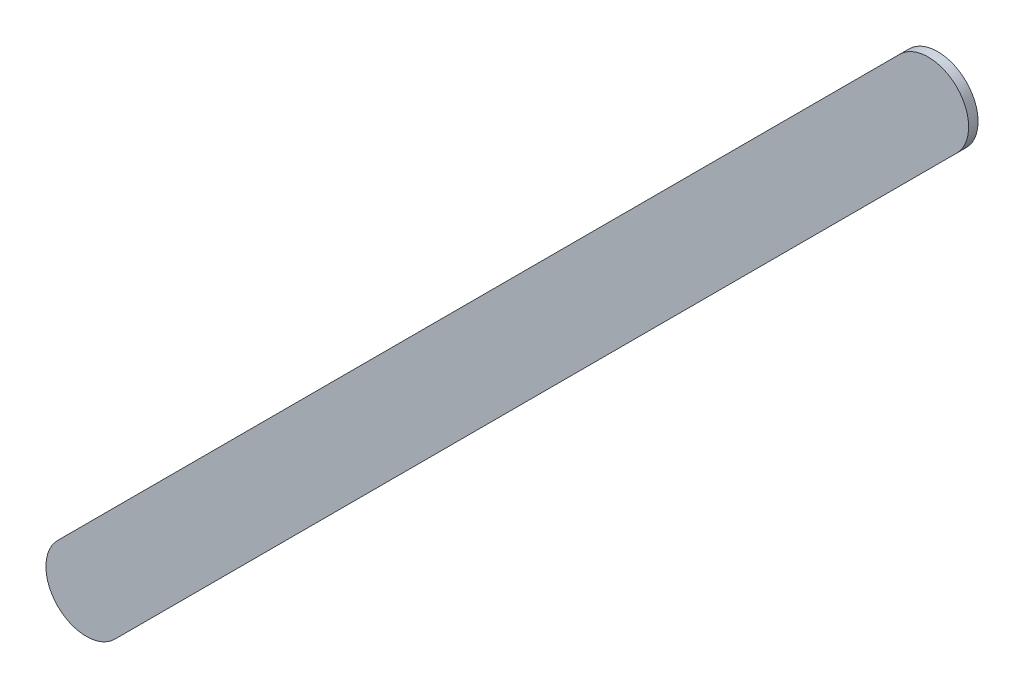
ISO-10303-21;
HEADER;
FILE_DESCRIPTION(('STEP AP214'),'2;1');
FILE_NAME('part.step','',(''),(''),'','','');
FILE_SCHEMA(('AUTOMOTIVE_DESIGN { 1 0 10303 214 1 1 1 1 }'));
ENDSEC;
DATA;
#1=APPLICATION_CONTEXT('core data for automotive mechanical design processes');
#2=APPLICATION_PROTOCOL_DEFINITION('international standard','automotive_design',2000,#1);
#3=PRODUCT_CONTEXT('',#1,'mechanical');
#4=PRODUCT('Part','Part','',(#3));
#5=PRODUCT_RELATED_PRODUCT_CATEGORY('part','',(#4));
#6=PRODUCT_DEFINITION_FORMATION('','',#4);
#7=PRODUCT_DEFINITION_CONTEXT('part definition',#1,'design');
#8=PRODUCT_DEFINITION('design','',#6,#7);
#9=PRODUCT_DEFINITION_SHAPE('','',#8);
#10=(LENGTH_UNIT() NAMED_UNIT(*) SI_UNIT(.MILLI.,.METRE.));
#11=(NAMED_UNIT(*) PLANE_ANGLE_UNIT() SI_UNIT($,.RADIAN.));
#12=(NAMED_UNIT(*) SI_UNIT($,.STERADIAN.) SOLID_ANGLE_UNIT());
#13=UNCERTAINTY_MEASURE_WITH_UNIT(LENGTH_MEASURE(1.E-05),#10,'distance_accuracy_value','');
#14=(GEOMETRIC_REPRESENTATION_CONTEXT(3) GLOBAL_UNCERTAINTY_ASSIGNED_CONTEXT((#13)) GLOBAL_UNIT_ASSIGNED_CONTEXT((#10,
#11,#12)) REPRESENTATION_CONTEXT('',''));
#15=CARTESIAN_POINT('',(0.,0.,0.));
#16=DIRECTION('',(0.,0.,1.));
#17=DIRECTION('',(1.,0.,0.));
#18=AXIS2_PLACEMENT_3D('',#15,#16,#17);
#19=CARTESIAN_POINT('',(149.306066,-55.626066,1.635));
#20=DIRECTION('',(0.,0.,1.));
#21=DIRECTION('',(1.,0.,0.));
#22=AXIS2_PLACEMENT_3D('',#19,#20,#21);
#23=PLANE('',#22);
#24=DIRECTION('',(0.707106781186548,0.707106781186548,0.));
#25=VECTOR('',#24,1.);
#26=CARTESIAN_POINT('',(149.306066,-55.626066,1.635));
#27=LINE('',#26,#25);
#28=CARTESIAN_POINT('',(149.306066,-55.626066,1.635));
#29=VERTEX_POINT('',#28);
#30=CARTESIAN_POINT('',(152.436066,-52.496066,1.635));
#31=VERTEX_POINT('',#30);
#32=EDGE_CURVE('E80',#29,#31,#27,.T.);
#33=ORIENTED_EDGE('',*,*,#32,.T.);
#34=CARTESIAN_POINT('',(152.3299995,-52.3899995,1.635));
#35=DIRECTION('',(0.,0.,1.));
#36=DIRECTION('',(0.707106781187048,-0.707106781186048,0.));
#37=AXIS2_PLACEMENT_3D('',#34,#35,#36);
#38=CIRCLE('',#37,0.150000682813);
#39=CARTESIAN_POINT('',(152.223933,-52.283933,1.635));
#40=VERTEX_POINT('',#39);
#41=EDGE_CURVE('E106',#31,#40,#38,.T.);
#42=ORIENTED_EDGE('',*,*,#41,.T.);
#43=DIRECTION('',(-0.707106781186548,-0.707106781186548,0.));
#44=VECTOR('',#43,1.);
#45=CARTESIAN_POINT('',(152.223933,-52.283933,1.635));
#46=LINE('',#45,#44);
#47=CARTESIAN_POINT('',(149.093933,-55.413933,1.635));
#48=VERTEX_POINT('',#47);
#49=EDGE_CURVE('E73',#40,#48,#46,.T.);
#50=ORIENTED_EDGE('',*,*,#49,.T.);
#51=CARTESIAN_POINT('',(149.1999995,-55.5199995,1.635));
#52=DIRECTION('',(0.,0.,1.));
#53=DIRECTION('',(-0.707106781186548,0.707106781186548,0.));
#54=AXIS2_PLACEMENT_3D('',#51,#52,#53);
#55=CIRCLE('',#54,0.150000682813);
#56=EDGE_CURVE('E11',#48,#29,#55,.T.);
#57=ORIENTED_EDGE('',*,*,#56,.T.);
#58=EDGE_LOOP('',(#33,#42,#50,#57));
#59=FACE_BOUND('',#58,.T.);
#60=ADVANCED_FACE('F17',(#59),#23,.T.);
#61=CARTESIAN_POINT('',(149.306066,-55.626066,1.6));
#62=DIRECTION('',(0.,0.,1.));
#63=DIRECTION('',(1.,0.,0.));
#64=AXIS2_PLACEMENT_3D('',#61,#62,#63);
#65=PLANE('',#64);
#66=CARTESIAN_POINT('',(149.1999995,-55.5199995,1.6));
#67=DIRECTION('',(0.,0.,1.));
#68=DIRECTION('',(-0.707106781186548,0.707106781186548,0.));
#69=AXIS2_PLACEMENT_3D('',#66,#67,#68);
#70=CIRCLE('',#69,0.150000682813);
#71=CARTESIAN_POINT('',(149.093933,-55.413933,1.6));
#72=VERTEX_POINT('',#71);
#73=CARTESIAN_POINT('',(149.306066,-55.626066,1.6));
#74=VERTEX_POINT('',#73);
#75=EDGE_CURVE('E25',#72,#74,#70,.T.);
#76=ORIENTED_EDGE('',*,*,#75,.F.);
#77=DIRECTION('',(-0.707106781186548,-0.707106781186548,0.));
#78=VECTOR('',#77,1.);
#79=CARTESIAN_POINT('',(152.223933,-52.283933,1.6));
#80=LINE('',#79,#78);
#81=CARTESIAN_POINT('',(152.223933,-52.283933,1.6));
#82=VERTEX_POINT('',#81);
#83=EDGE_CURVE('E98',#82,#72,#80,.T.);
#84=ORIENTED_EDGE('',*,*,#83,.F.);
#85=CARTESIAN_POINT('',(152.3299995,-52.3899995,1.6));
#86=DIRECTION('',(0.,0.,1.));
#87=DIRECTION('',(0.707106781187048,-0.707106781186048,0.));
#88=AXIS2_PLACEMENT_3D('',#85,#86,#87);
#89=CIRCLE('',#88,0.150000682813);
#90=CARTESIAN_POINT('',(152.436066,-52.496066,1.6));
#91=VERTEX_POINT('',#90);
#92=EDGE_CURVE('E82',#91,#82,#89,.T.);
#93=ORIENTED_EDGE('',*,*,#92,.F.);
#94=DIRECTION('',(0.707106781186548,0.707106781186548,0.));
#95=VECTOR('',#94,1.);
#96=CARTESIAN_POINT('',(149.306066,-55.626066,1.6));
#97=LINE('',#96,#95);
#98=EDGE_CURVE('E78',#74,#91,#97,.T.);
#99=ORIENTED_EDGE('',*,*,#98,.F.);
#100=EDGE_LOOP('',(#76,#84,#93,#99));
#101=FACE_BOUND('',#100,.T.);
#102=ADVANCED_FACE('F84',(#101),#65,.F.);
#103=CARTESIAN_POINT('',(149.1999995,-55.5199995,1.6));
#104=DIRECTION('',(0.,0.,-1.));
#105=DIRECTION('',(-0.707106781186548,0.707106781186548,0.));
#106=AXIS2_PLACEMENT_3D('',#103,#104,#105);
#107=CYLINDRICAL_SURFACE('',#106,0.150000682813);
#108=ORIENTED_EDGE('',*,*,#75,.T.);
#109=DIRECTION('',(0.,0.,1.));
#110=VECTOR('',#109,1.);
#111=CARTESIAN_POINT('',(149.306066,-55.626066,1.6));
#112=LINE('',#111,#110);
#113=EDGE_CURVE('E67',#74,#29,#112,.T.);
#114=ORIENTED_EDGE('',*,*,#113,.T.);
#115=ORIENTED_EDGE('',*,*,#56,.F.);
#116=DIRECTION('',(0.,0.,1.));
#117=VECTOR('',#116,1.);
#118=CARTESIAN_POINT('',(149.093933,-55.413933,1.6));
#119=LINE('',#118,#117);
#120=EDGE_CURVE('E70',#72,#48,#119,.T.);
#121=ORIENTED_EDGE('',*,*,#120,.F.);
#122=EDGE_LOOP('',(#108,#114,#115,#121));
#123=FACE_BOUND('',#122,.T.);
#124=ADVANCED_FACE('F66',(#123),#107,.T.);
#125=CARTESIAN_POINT('',(152.223933,-52.283933,1.6));
#126=DIRECTION('',(0.707106781186548,-0.707106781186548,0.));
#127=DIRECTION('',(0.,0.,-1.));
#128=AXIS2_PLACEMENT_3D('',#125,#126,#127);
#129=PLANE('',#128);
#130=ORIENTED_EDGE('',*,*,#83,.T.);
#131=ORIENTED_EDGE('',*,*,#120,.T.);
#132=ORIENTED_EDGE('',*,*,#49,.F.);
#133=DIRECTION('',(0.,0.,1.));
#134=VECTOR('',#133,1.);
#135=CARTESIAN_POINT('',(152.223933,-52.283933,1.6));
#136=LINE('',#135,#134);
#137=EDGE_CURVE('E100',#82,#40,#136,.T.);
#138=ORIENTED_EDGE('',*,*,#137,.F.);
#139=EDGE_LOOP('',(#130,#131,#132,#138));
#140=FACE_BOUND('',#139,.T.);
#141=ADVANCED_FACE('F119',(#140),#129,.F.);
#142=CARTESIAN_POINT('',(152.3299995,-52.3899995,1.6));
#143=DIRECTION('',(0.,0.,-1.));
#144=DIRECTION('',(0.707106781187048,-0.707106781186048,0.));
#145=AXIS2_PLACEMENT_3D('',#142,#143,#144);
#146=CYLINDRICAL_SURFACE('',#145,0.150000682813);
#147=ORIENTED_EDGE('',*,*,#92,.T.);
#148=ORIENTED_EDGE('',*,*,#137,.T.);
#149=ORIENTED_EDGE('',*,*,#41,.F.);
#150=DIRECTION('',(0.,0.,1.));
#151=VECTOR('',#150,1.);
#152=CARTESIAN_POINT('',(152.436066,-52.496066,1.6));
#153=LINE('',#152,#151);
#154=EDGE_CURVE('E88',#91,#31,#153,.T.);
#155=ORIENTED_EDGE('',*,*,#154,.F.);
#156=EDGE_LOOP('',(#147,#148,#149,#155));
#157=FACE_BOUND('',#156,.T.);
#158=ADVANCED_FACE('F121',(#157),#146,.T.);
#159=CARTESIAN_POINT('',(149.306066,-55.626066,1.6));
#160=DIRECTION('',(-0.707106781186548,0.707106781186548,0.));
#161=DIRECTION('',(0.,0.,1.));
#162=AXIS2_PLACEMENT_3D('',#159,#160,#161);
#163=PLANE('',#162);
#164=ORIENTED_EDGE('',*,*,#98,.T.);
#165=ORIENTED_EDGE('',*,*,#154,.T.);
#166=ORIENTED_EDGE('',*,*,#32,.F.);
#167=ORIENTED_EDGE('',*,*,#113,.F.);
#168=EDGE_LOOP('',(#164,#165,#166,#167));
#169=FACE_BOUND('',#168,.T.);
#170=ADVANCED_FACE('F76',(#169),#163,.F.);
#171=CLOSED_SHELL('',(#60,#102,#124,#141,#158,#170));
#172=MANIFOLD_SOLID_BREP('B1',#171);
#173=ADVANCED_BREP_SHAPE_REPRESENTATION('',(#18,#172),#14);
#174=SHAPE_DEFINITION_REPRESENTATION(#9,#173);
ENDSEC;
END-ISO-10303-21;
